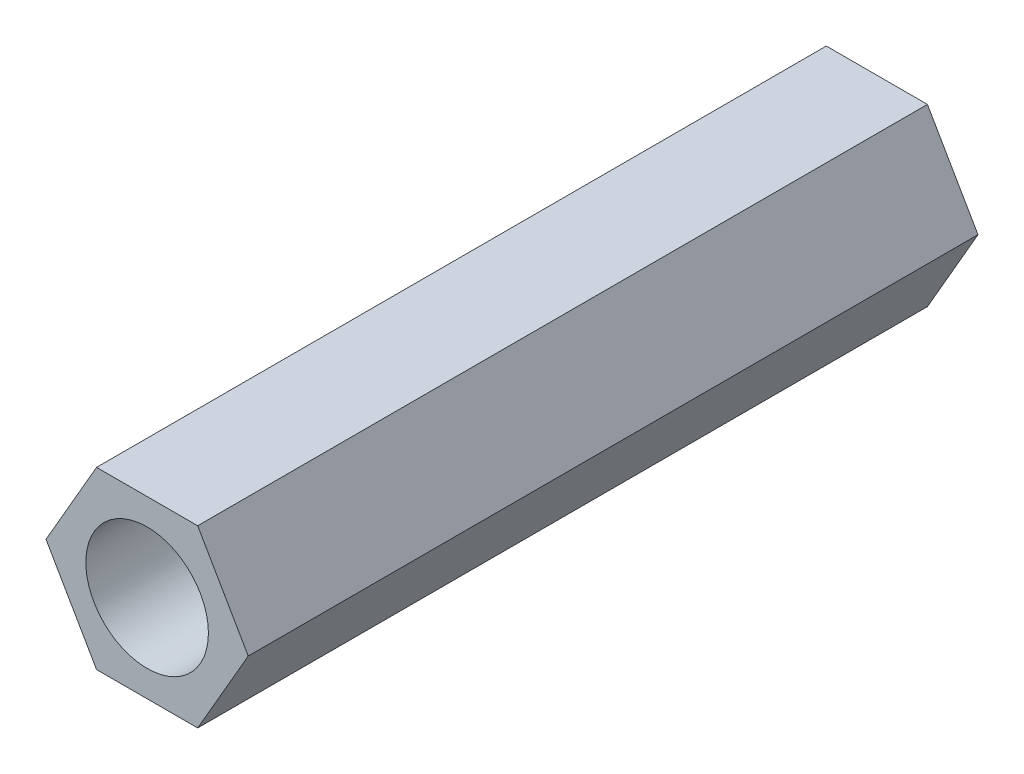
ISO-10303-21;
HEADER;
FILE_DESCRIPTION(('STEP AP214'),'2;1');
FILE_NAME('part.step','',(''),(''),'','','');
FILE_SCHEMA(('AUTOMOTIVE_DESIGN { 1 0 10303 214 1 1 1 1 }'));
ENDSEC;
DATA;
#1=APPLICATION_CONTEXT('core data for automotive mechanical design processes');
#2=APPLICATION_PROTOCOL_DEFINITION('international standard','automotive_design',2000,#1);
#3=PRODUCT_CONTEXT('',#1,'mechanical');
#4=PRODUCT('Part','Part','',(#3));
#5=PRODUCT_RELATED_PRODUCT_CATEGORY('part','',(#4));
#6=PRODUCT_DEFINITION_FORMATION('','',#4);
#7=PRODUCT_DEFINITION_CONTEXT('part definition',#1,'design');
#8=PRODUCT_DEFINITION('design','',#6,#7);
#9=PRODUCT_DEFINITION_SHAPE('','',#8);
#10=(LENGTH_UNIT() NAMED_UNIT(*) SI_UNIT(.MILLI.,.METRE.));
#11=(NAMED_UNIT(*) PLANE_ANGLE_UNIT() SI_UNIT($,.RADIAN.));
#12=(NAMED_UNIT(*) SI_UNIT($,.STERADIAN.) SOLID_ANGLE_UNIT());
#13=UNCERTAINTY_MEASURE_WITH_UNIT(LENGTH_MEASURE(1.E-05),#10,'distance_accuracy_value','');
#14=(GEOMETRIC_REPRESENTATION_CONTEXT(3) GLOBAL_UNCERTAINTY_ASSIGNED_CONTEXT((#13)) GLOBAL_UNIT_ASSIGNED_CONTEXT((#10,
#11,#12)) REPRESENTATION_CONTEXT('',''));
#15=CARTESIAN_POINT('',(0.,0.,0.));
#16=DIRECTION('',(0.,0.,1.));
#17=DIRECTION('',(1.,0.,0.));
#18=AXIS2_PLACEMENT_3D('',#15,#16,#17);
#19=CARTESIAN_POINT('',(0.,0.,25.));
#20=DIRECTION('',(0.,0.,1.));
#21=DIRECTION('',(1.,0.,0.));
#22=AXIS2_PLACEMENT_3D('',#19,#20,#21);
#23=PLANE('',#22);
#24=DIRECTION('',(-0.500000000000001,0.866025403784438,0.));
#25=VECTOR('',#24,1.);
#26=CARTESIAN_POINT('',(3.46410161513776,0.,25.));
#27=LINE('',#26,#25);
#28=CARTESIAN_POINT('',(3.46410161513776,0.,25.));
#29=VERTEX_POINT('',#28);
#30=CARTESIAN_POINT('',(1.73205080756888,3.,25.));
#31=VERTEX_POINT('',#30);
#32=EDGE_CURVE('E137',#29,#31,#27,.T.);
#33=ORIENTED_EDGE('',*,*,#32,.T.);
#34=DIRECTION('',(-1.,0.,0.));
#35=VECTOR('',#34,1.);
#36=CARTESIAN_POINT('',(1.73205080756888,3.,25.));
#37=LINE('',#36,#35);
#38=CARTESIAN_POINT('',(-1.73205080756888,3.,25.));
#39=VERTEX_POINT('',#38);
#40=EDGE_CURVE('E95',#31,#39,#37,.T.);
#41=ORIENTED_EDGE('',*,*,#40,.T.);
#42=DIRECTION('',(-0.5,-0.866025403784439,0.));
#43=VECTOR('',#42,1.);
#44=CARTESIAN_POINT('',(-1.73205080756888,3.,25.));
#45=LINE('',#44,#43);
#46=CARTESIAN_POINT('',(-3.46410161513775,0.,25.));
#47=VERTEX_POINT('',#46);
#48=EDGE_CURVE('E108',#39,#47,#45,.T.);
#49=ORIENTED_EDGE('',*,*,#48,.T.);
#50=DIRECTION('',(0.500000000000001,-0.866025403784438,0.));
#51=VECTOR('',#50,1.);
#52=CARTESIAN_POINT('',(-3.46410161513775,0.,25.));
#53=LINE('',#52,#51);
#54=CARTESIAN_POINT('',(-1.73205080756887,-3.,25.));
#55=VERTEX_POINT('',#54);
#56=EDGE_CURVE('E102',#47,#55,#53,.T.);
#57=ORIENTED_EDGE('',*,*,#56,.T.);
#58=DIRECTION('',(1.,0.,0.));
#59=VECTOR('',#58,1.);
#60=CARTESIAN_POINT('',(-1.73205080756887,-3.,25.));
#61=LINE('',#60,#59);
#62=CARTESIAN_POINT('',(1.73205080756888,-3.,25.));
#63=VERTEX_POINT('',#62);
#64=EDGE_CURVE('E106',#55,#63,#61,.T.);
#65=ORIENTED_EDGE('',*,*,#64,.T.);
#66=DIRECTION('',(0.5,0.866025403784439,0.));
#67=VECTOR('',#66,1.);
#68=CARTESIAN_POINT('',(1.73205080756888,-3.,25.));
#69=LINE('',#68,#67);
#70=EDGE_CURVE('E58',#63,#29,#69,.T.);
#71=ORIENTED_EDGE('',*,*,#70,.T.);
#72=EDGE_LOOP('',(#33,#41,#49,#57,#65,#71));
#73=FACE_BOUND('',#72,.T.);
#74=CARTESIAN_POINT('',(0.,0.,25.));
#75=DIRECTION('',(0.,0.,1.));
#76=DIRECTION('',(1.,0.,0.));
#77=AXIS2_PLACEMENT_3D('',#74,#75,#76);
#78=CIRCLE('',#77,2.1);
#79=CARTESIAN_POINT('',(2.1,0.,25.));
#80=VERTEX_POINT('',#79);
#81=EDGE_CURVE('E130',#80,#80,#78,.T.);
#82=ORIENTED_EDGE('',*,*,#81,.F.);
#83=EDGE_LOOP('',(#82));
#84=FACE_BOUND('',#83,.T.);
#85=ADVANCED_FACE('F41',(#73,#84),#23,.T.);
#86=CARTESIAN_POINT('',(0.,0.,0.));
#87=DIRECTION('',(0.,0.,1.));
#88=DIRECTION('',(1.,0.,0.));
#89=AXIS2_PLACEMENT_3D('',#86,#87,#88);
#90=PLANE('',#89);
#91=DIRECTION('',(-0.500000000000001,0.866025403784438,0.));
#92=VECTOR('',#91,1.);
#93=CARTESIAN_POINT('',(3.46410161513776,0.,0.));
#94=LINE('',#93,#92);
#95=CARTESIAN_POINT('',(3.46410161513776,0.,0.));
#96=VERTEX_POINT('',#95);
#97=CARTESIAN_POINT('',(1.73205080756888,3.,0.));
#98=VERTEX_POINT('',#97);
#99=EDGE_CURVE('E126',#96,#98,#94,.T.);
#100=ORIENTED_EDGE('',*,*,#99,.F.);
#101=DIRECTION('',(0.5,0.866025403784439,0.));
#102=VECTOR('',#101,1.);
#103=CARTESIAN_POINT('',(1.73205080756888,-3.,0.));
#104=LINE('',#103,#102);
#105=CARTESIAN_POINT('',(1.73205080756888,-3.,0.));
#106=VERTEX_POINT('',#105);
#107=EDGE_CURVE('E87',#106,#96,#104,.T.);
#108=ORIENTED_EDGE('',*,*,#107,.F.);
#109=DIRECTION('',(1.,0.,0.));
#110=VECTOR('',#109,1.);
#111=CARTESIAN_POINT('',(-1.73205080756887,-3.,0.));
#112=LINE('',#111,#110);
#113=CARTESIAN_POINT('',(-1.73205080756887,-3.,0.));
#114=VERTEX_POINT('',#113);
#115=EDGE_CURVE('E81',#114,#106,#112,.T.);
#116=ORIENTED_EDGE('',*,*,#115,.F.);
#117=DIRECTION('',(0.500000000000001,-0.866025403784438,0.));
#118=VECTOR('',#117,1.);
#119=CARTESIAN_POINT('',(-3.46410161513775,0.,0.));
#120=LINE('',#119,#118);
#121=CARTESIAN_POINT('',(-3.46410161513775,0.,0.));
#122=VERTEX_POINT('',#121);
#123=EDGE_CURVE('E116',#122,#114,#120,.T.);
#124=ORIENTED_EDGE('',*,*,#123,.F.);
#125=DIRECTION('',(-0.5,-0.866025403784439,0.));
#126=VECTOR('',#125,1.);
#127=CARTESIAN_POINT('',(-1.73205080756888,3.,0.));
#128=LINE('',#127,#126);
#129=CARTESIAN_POINT('',(-1.73205080756888,3.,0.));
#130=VERTEX_POINT('',#129);
#131=EDGE_CURVE('E132',#130,#122,#128,.T.);
#132=ORIENTED_EDGE('',*,*,#131,.F.);
#133=DIRECTION('',(-1.,0.,0.));
#134=VECTOR('',#133,1.);
#135=CARTESIAN_POINT('',(1.73205080756888,3.,0.));
#136=LINE('',#135,#134);
#137=EDGE_CURVE('E129',#98,#130,#136,.T.);
#138=ORIENTED_EDGE('',*,*,#137,.F.);
#139=EDGE_LOOP('',(#100,#108,#116,#124,#132,#138));
#140=FACE_BOUND('',#139,.T.);
#141=CARTESIAN_POINT('',(0.,0.,0.));
#142=DIRECTION('',(0.,0.,1.));
#143=DIRECTION('',(1.,0.,0.));
#144=AXIS2_PLACEMENT_3D('',#141,#142,#143);
#145=CIRCLE('',#144,2.1);
#146=CARTESIAN_POINT('',(2.1,0.,0.));
#147=VERTEX_POINT('',#146);
#148=EDGE_CURVE('E230',#147,#147,#145,.T.);
#149=ORIENTED_EDGE('',*,*,#148,.T.);
#150=EDGE_LOOP('',(#149));
#151=FACE_BOUND('',#150,.T.);
#152=ADVANCED_FACE('F146',(#140,#151),#90,.F.);
#153=CARTESIAN_POINT('',(3.46410161513776,0.,25.));
#154=DIRECTION('',(-0.866025403784438,-0.500000000000001,0.));
#155=DIRECTION('',(0.500000000000001,-0.866025403784438,0.));
#156=AXIS2_PLACEMENT_3D('',#153,#154,#155);
#157=PLANE('',#156);
#158=ORIENTED_EDGE('',*,*,#99,.T.);
#159=DIRECTION('',(0.,0.,-1.));
#160=VECTOR('',#159,1.);
#161=CARTESIAN_POINT('',(1.73205080756888,3.,25.));
#162=LINE('',#161,#160);
#163=EDGE_CURVE('E11',#31,#98,#162,.T.);
#164=ORIENTED_EDGE('',*,*,#163,.F.);
#165=ORIENTED_EDGE('',*,*,#32,.F.);
#166=DIRECTION('',(0.,0.,-1.));
#167=VECTOR('',#166,1.);
#168=CARTESIAN_POINT('',(3.46410161513776,0.,25.));
#169=LINE('',#168,#167);
#170=EDGE_CURVE('E122',#29,#96,#169,.T.);
#171=ORIENTED_EDGE('',*,*,#170,.T.);
#172=EDGE_LOOP('',(#158,#164,#165,#171));
#173=FACE_BOUND('',#172,.T.);
#174=ADVANCED_FACE('F43',(#173),#157,.F.);
#175=CARTESIAN_POINT('',(1.73205080756888,3.,25.));
#176=DIRECTION('',(0.,-1.,0.));
#177=DIRECTION('',(1.,0.,0.));
#178=AXIS2_PLACEMENT_3D('',#175,#176,#177);
#179=PLANE('',#178);
#180=ORIENTED_EDGE('',*,*,#137,.T.);
#181=DIRECTION('',(0.,0.,-1.));
#182=VECTOR('',#181,1.);
#183=CARTESIAN_POINT('',(-1.73205080756888,3.,25.));
#184=LINE('',#183,#182);
#185=EDGE_CURVE('E50',#39,#130,#184,.T.);
#186=ORIENTED_EDGE('',*,*,#185,.F.);
#187=ORIENTED_EDGE('',*,*,#40,.F.);
#188=ORIENTED_EDGE('',*,*,#163,.T.);
#189=EDGE_LOOP('',(#180,#186,#187,#188));
#190=FACE_BOUND('',#189,.T.);
#191=ADVANCED_FACE('F171',(#190),#179,.F.);
#192=CARTESIAN_POINT('',(-1.73205080756888,3.,25.));
#193=DIRECTION('',(0.866025403784439,-0.5,0.));
#194=DIRECTION('',(0.5,0.866025403784439,0.));
#195=AXIS2_PLACEMENT_3D('',#192,#193,#194);
#196=PLANE('',#195);
#197=ORIENTED_EDGE('',*,*,#131,.T.);
#198=DIRECTION('',(0.,0.,-1.));
#199=VECTOR('',#198,1.);
#200=CARTESIAN_POINT('',(-3.46410161513775,0.,25.));
#201=LINE('',#200,#199);
#202=EDGE_CURVE('E117',#47,#122,#201,.T.);
#203=ORIENTED_EDGE('',*,*,#202,.F.);
#204=ORIENTED_EDGE('',*,*,#48,.F.);
#205=ORIENTED_EDGE('',*,*,#185,.T.);
#206=EDGE_LOOP('',(#197,#203,#204,#205));
#207=FACE_BOUND('',#206,.T.);
#208=ADVANCED_FACE('F143',(#207),#196,.F.);
#209=CARTESIAN_POINT('',(-3.46410161513775,0.,25.));
#210=DIRECTION('',(0.866025403784438,0.500000000000001,0.));
#211=DIRECTION('',(-0.500000000000001,0.866025403784438,0.));
#212=AXIS2_PLACEMENT_3D('',#209,#210,#211);
#213=PLANE('',#212);
#214=ORIENTED_EDGE('',*,*,#123,.T.);
#215=DIRECTION('',(0.,0.,-1.));
#216=VECTOR('',#215,1.);
#217=CARTESIAN_POINT('',(-1.73205080756887,-3.,25.));
#218=LINE('',#217,#216);
#219=EDGE_CURVE('E113',#55,#114,#218,.T.);
#220=ORIENTED_EDGE('',*,*,#219,.F.);
#221=ORIENTED_EDGE('',*,*,#56,.F.);
#222=ORIENTED_EDGE('',*,*,#202,.T.);
#223=EDGE_LOOP('',(#214,#220,#221,#222));
#224=FACE_BOUND('',#223,.T.);
#225=ADVANCED_FACE('F114',(#224),#213,.F.);
#226=CARTESIAN_POINT('',(-1.73205080756887,-3.,25.));
#227=DIRECTION('',(0.,1.,0.));
#228=DIRECTION('',(-1.,0.,0.));
#229=AXIS2_PLACEMENT_3D('',#226,#227,#228);
#230=PLANE('',#229);
#231=ORIENTED_EDGE('',*,*,#115,.T.);
#232=DIRECTION('',(0.,0.,-1.));
#233=VECTOR('',#232,1.);
#234=CARTESIAN_POINT('',(1.73205080756888,-3.,25.));
#235=LINE('',#234,#233);
#236=EDGE_CURVE('E118',#63,#106,#235,.T.);
#237=ORIENTED_EDGE('',*,*,#236,.F.);
#238=ORIENTED_EDGE('',*,*,#64,.F.);
#239=ORIENTED_EDGE('',*,*,#219,.T.);
#240=EDGE_LOOP('',(#231,#237,#238,#239));
#241=FACE_BOUND('',#240,.T.);
#242=ADVANCED_FACE('F120',(#241),#230,.F.);
#243=CARTESIAN_POINT('',(1.73205080756888,-3.,25.));
#244=DIRECTION('',(-0.866025403784439,0.5,0.));
#245=DIRECTION('',(-0.5,-0.866025403784439,0.));
#246=AXIS2_PLACEMENT_3D('',#243,#244,#245);
#247=PLANE('',#246);
#248=ORIENTED_EDGE('',*,*,#107,.T.);
#249=ORIENTED_EDGE('',*,*,#170,.F.);
#250=ORIENTED_EDGE('',*,*,#70,.F.);
#251=ORIENTED_EDGE('',*,*,#236,.T.);
#252=EDGE_LOOP('',(#248,#249,#250,#251));
#253=FACE_BOUND('',#252,.T.);
#254=ADVANCED_FACE('F151',(#253),#247,.F.);
#255=CARTESIAN_POINT('',(0.,0.,25.));
#256=DIRECTION('',(0.,0.,-1.));
#257=DIRECTION('',(-1.,0.,0.));
#258=AXIS2_PLACEMENT_3D('',#255,#256,#257);
#259=CYLINDRICAL_SURFACE('',#258,2.1);
#260=ORIENTED_EDGE('',*,*,#81,.T.);
#261=EDGE_LOOP('',(#260));
#262=FACE_BOUND('',#261,.T.);
#263=ORIENTED_EDGE('',*,*,#148,.F.);
#264=EDGE_LOOP('',(#263));
#265=FACE_BOUND('',#264,.T.);
#266=ADVANCED_FACE('F153',(#262,#265),#259,.F.);
#267=CLOSED_SHELL('',(#85,#152,#174,#191,#208,#225,#242,#254,#266));
#268=MANIFOLD_SOLID_BREP('B2',#267);
#269=ADVANCED_BREP_SHAPE_REPRESENTATION('',(#18,#268),#14);
#270=SHAPE_DEFINITION_REPRESENTATION(#9,#269);
ENDSEC;
END-ISO-10303-21;
